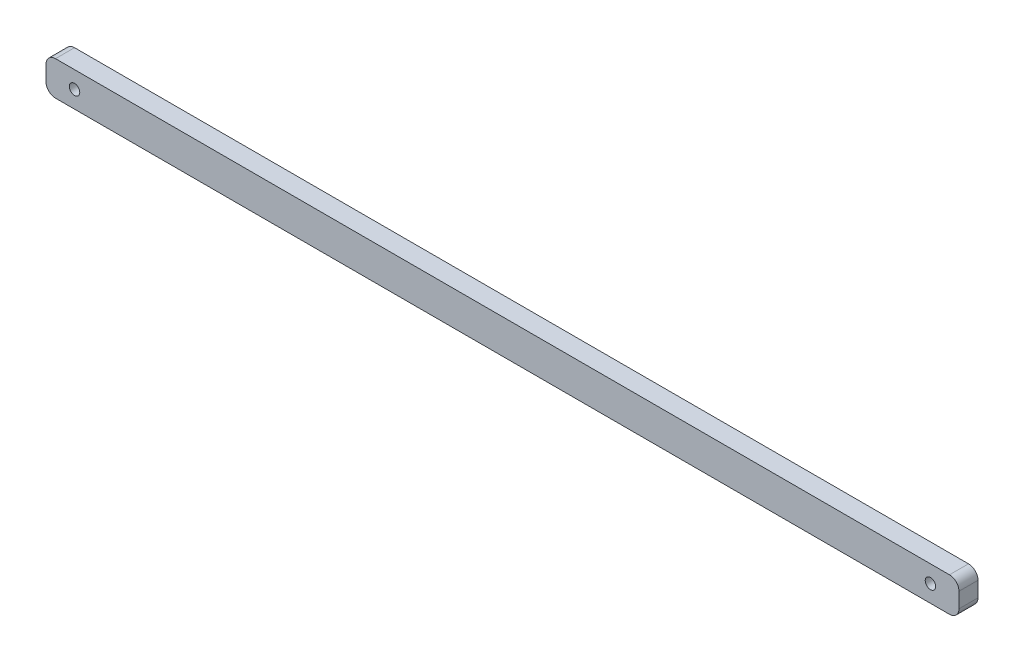
ISO-10303-21;
HEADER;
FILE_DESCRIPTION(('STEP AP214'),'2;1');
FILE_NAME('part.step','',(''),(''),'','','');
FILE_SCHEMA(('AUTOMOTIVE_DESIGN { 1 0 10303 214 1 1 1 1 }'));
ENDSEC;
DATA;
#1=APPLICATION_CONTEXT('core data for automotive mechanical design processes');
#2=APPLICATION_PROTOCOL_DEFINITION('international standard','automotive_design',2000,#1);
#3=PRODUCT_CONTEXT('',#1,'mechanical');
#4=PRODUCT('Part','Part','',(#3));
#5=PRODUCT_RELATED_PRODUCT_CATEGORY('part','',(#4));
#6=PRODUCT_DEFINITION_FORMATION('','',#4);
#7=PRODUCT_DEFINITION_CONTEXT('part definition',#1,'design');
#8=PRODUCT_DEFINITION('design','',#6,#7);
#9=PRODUCT_DEFINITION_SHAPE('','',#8);
#10=(LENGTH_UNIT() NAMED_UNIT(*) SI_UNIT(.MILLI.,.METRE.));
#11=(NAMED_UNIT(*) PLANE_ANGLE_UNIT() SI_UNIT($,.RADIAN.));
#12=(NAMED_UNIT(*) SI_UNIT($,.STERADIAN.) SOLID_ANGLE_UNIT());
#13=UNCERTAINTY_MEASURE_WITH_UNIT(LENGTH_MEASURE(1.E-05),#10,'distance_accuracy_value','');
#14=(GEOMETRIC_REPRESENTATION_CONTEXT(3) GLOBAL_UNCERTAINTY_ASSIGNED_CONTEXT((#13)) GLOBAL_UNIT_ASSIGNED_CONTEXT((#10,
#11,#12)) REPRESENTATION_CONTEXT('',''));
#15=CARTESIAN_POINT('',(0.,0.,0.));
#16=DIRECTION('',(0.,0.,1.));
#17=DIRECTION('',(1.,0.,0.));
#18=AXIS2_PLACEMENT_3D('',#15,#16,#17);
#19=CARTESIAN_POINT('',(0.,0.,10.));
#20=DIRECTION('',(0.,0.,1.));
#21=DIRECTION('',(1.,0.,0.));
#22=AXIS2_PLACEMENT_3D('',#19,#20,#21);
#23=PLANE('',#22);
#24=CARTESIAN_POINT('',(15.,-9.,10.));
#25=DIRECTION('',(0.,0.,1.));
#26=DIRECTION('',(1.,0.,0.));
#27=AXIS2_PLACEMENT_3D('',#24,#25,#26);
#28=CIRCLE('',#27,2.75);
#29=CARTESIAN_POINT('',(17.75,-9.,10.));
#30=VERTEX_POINT('',#29);
#31=EDGE_CURVE('E170',#30,#30,#28,.T.);
#32=ORIENTED_EDGE('',*,*,#31,.F.);
#33=EDGE_LOOP('',(#32));
#34=FACE_BOUND('',#33,.T.);
#35=DIRECTION('',(0.,1.,0.));
#36=VECTOR('',#35,1.);
#37=CARTESIAN_POINT('',(480.,0.,10.));
#38=LINE('',#37,#36);
#39=CARTESIAN_POINT('',(480.,-13.,10.));
#40=VERTEX_POINT('',#39);
#41=CARTESIAN_POINT('',(480.,-5.,10.));
#42=VERTEX_POINT('',#41);
#43=EDGE_CURVE('E174',#40,#42,#38,.T.);
#44=ORIENTED_EDGE('',*,*,#43,.T.);
#45=CARTESIAN_POINT('',(475.,-5.,10.));
#46=DIRECTION('',(0.,0.,1.));
#47=DIRECTION('',(1.,0.,0.));
#48=AXIS2_PLACEMENT_3D('',#45,#46,#47);
#49=CIRCLE('',#48,5.);
#50=CARTESIAN_POINT('',(475.,0.,10.));
#51=VERTEX_POINT('',#50);
#52=EDGE_CURVE('E151',#42,#51,#49,.T.);
#53=ORIENTED_EDGE('',*,*,#52,.T.);
#54=DIRECTION('',(-1.,0.,0.));
#55=VECTOR('',#54,1.);
#56=CARTESIAN_POINT('',(0.,0.,10.));
#57=LINE('',#56,#55);
#58=CARTESIAN_POINT('',(5.,0.,10.));
#59=VERTEX_POINT('',#58);
#60=EDGE_CURVE('E122',#51,#59,#57,.T.);
#61=ORIENTED_EDGE('',*,*,#60,.T.);
#62=CARTESIAN_POINT('',(5.,-5.,10.));
#63=DIRECTION('',(0.,0.,1.));
#64=DIRECTION('',(1.,0.,0.));
#65=AXIS2_PLACEMENT_3D('',#62,#63,#64);
#66=CIRCLE('',#65,5.);
#67=CARTESIAN_POINT('',(0.,-5.,10.));
#68=VERTEX_POINT('',#67);
#69=EDGE_CURVE('E147',#59,#68,#66,.T.);
#70=ORIENTED_EDGE('',*,*,#69,.T.);
#71=DIRECTION('',(0.,-1.,0.));
#72=VECTOR('',#71,1.);
#73=CARTESIAN_POINT('',(0.,0.,10.));
#74=LINE('',#73,#72);
#75=CARTESIAN_POINT('',(0.,-13.,10.));
#76=VERTEX_POINT('',#75);
#77=EDGE_CURVE('E130',#68,#76,#74,.T.);
#78=ORIENTED_EDGE('',*,*,#77,.T.);
#79=CARTESIAN_POINT('',(5.,-13.,10.));
#80=DIRECTION('',(0.,0.,1.));
#81=DIRECTION('',(1.,0.,0.));
#82=AXIS2_PLACEMENT_3D('',#79,#80,#81);
#83=CIRCLE('',#82,5.);
#84=CARTESIAN_POINT('',(5.,-18.,10.));
#85=VERTEX_POINT('',#84);
#86=EDGE_CURVE('E57',#76,#85,#83,.T.);
#87=ORIENTED_EDGE('',*,*,#86,.T.);
#88=DIRECTION('',(1.,0.,0.));
#89=VECTOR('',#88,1.);
#90=CARTESIAN_POINT('',(0.,-18.,10.));
#91=LINE('',#90,#89);
#92=CARTESIAN_POINT('',(475.,-18.,10.));
#93=VERTEX_POINT('',#92);
#94=EDGE_CURVE('E133',#85,#93,#91,.T.);
#95=ORIENTED_EDGE('',*,*,#94,.T.);
#96=CARTESIAN_POINT('',(475.,-13.,10.));
#97=DIRECTION('',(0.,0.,1.));
#98=DIRECTION('',(1.,0.,0.));
#99=AXIS2_PLACEMENT_3D('',#96,#97,#98);
#100=CIRCLE('',#99,5.);
#101=EDGE_CURVE('E149',#93,#40,#100,.T.);
#102=ORIENTED_EDGE('',*,*,#101,.T.);
#103=EDGE_LOOP('',(#44,#53,#61,#70,#78,#87,#95,#102));
#104=FACE_BOUND('',#103,.T.);
#105=CARTESIAN_POINT('',(465.,-9.,10.));
#106=DIRECTION('',(0.,0.,1.));
#107=DIRECTION('',(-1.,0.,0.));
#108=AXIS2_PLACEMENT_3D('',#105,#106,#107);
#109=CIRCLE('',#108,2.75000000000004);
#110=CARTESIAN_POINT('',(462.25,-9.,10.));
#111=VERTEX_POINT('',#110);
#112=EDGE_CURVE('E180',#111,#111,#109,.T.);
#113=ORIENTED_EDGE('',*,*,#112,.F.);
#114=EDGE_LOOP('',(#113));
#115=FACE_BOUND('',#114,.T.);
#116=ADVANCED_FACE('F35',(#34,#104,#115),#23,.T.);
#117=CARTESIAN_POINT('',(0.,0.,0.));
#118=DIRECTION('',(0.,0.,1.));
#119=DIRECTION('',(1.,0.,0.));
#120=AXIS2_PLACEMENT_3D('',#117,#118,#119);
#121=PLANE('',#120);
#122=DIRECTION('',(-1.,0.,0.));
#123=VECTOR('',#122,1.);
#124=CARTESIAN_POINT('',(0.,0.,0.));
#125=LINE('',#124,#123);
#126=CARTESIAN_POINT('',(475.,0.,0.));
#127=VERTEX_POINT('',#126);
#128=CARTESIAN_POINT('',(5.,0.,0.));
#129=VERTEX_POINT('',#128);
#130=EDGE_CURVE('E119',#127,#129,#125,.T.);
#131=ORIENTED_EDGE('',*,*,#130,.F.);
#132=CARTESIAN_POINT('',(475.,-5.,0.));
#133=DIRECTION('',(0.,0.,1.));
#134=DIRECTION('',(1.,0.,0.));
#135=AXIS2_PLACEMENT_3D('',#132,#133,#134);
#136=CIRCLE('',#135,5.);
#137=CARTESIAN_POINT('',(480.,-5.,0.));
#138=VERTEX_POINT('',#137);
#139=EDGE_CURVE('E102',#127,#138,#136,.F.);
#140=ORIENTED_EDGE('',*,*,#139,.T.);
#141=DIRECTION('',(0.,1.,0.));
#142=VECTOR('',#141,1.);
#143=CARTESIAN_POINT('',(480.,0.,0.));
#144=LINE('',#143,#142);
#145=CARTESIAN_POINT('',(480.,-13.,0.));
#146=VERTEX_POINT('',#145);
#147=EDGE_CURVE('E131',#146,#138,#144,.T.);
#148=ORIENTED_EDGE('',*,*,#147,.F.);
#149=CARTESIAN_POINT('',(475.,-13.,0.));
#150=DIRECTION('',(0.,0.,1.));
#151=DIRECTION('',(1.,0.,0.));
#152=AXIS2_PLACEMENT_3D('',#149,#150,#151);
#153=CIRCLE('',#152,5.);
#154=CARTESIAN_POINT('',(475.,-18.,0.));
#155=VERTEX_POINT('',#154);
#156=EDGE_CURVE('E113',#146,#155,#153,.F.);
#157=ORIENTED_EDGE('',*,*,#156,.T.);
#158=DIRECTION('',(1.,0.,0.));
#159=VECTOR('',#158,1.);
#160=CARTESIAN_POINT('',(0.,-18.,0.));
#161=LINE('',#160,#159);
#162=CARTESIAN_POINT('',(5.,-18.,0.));
#163=VERTEX_POINT('',#162);
#164=EDGE_CURVE('E135',#163,#155,#161,.T.);
#165=ORIENTED_EDGE('',*,*,#164,.F.);
#166=CARTESIAN_POINT('',(5.,-13.,0.));
#167=DIRECTION('',(0.,0.,1.));
#168=DIRECTION('',(1.,0.,0.));
#169=AXIS2_PLACEMENT_3D('',#166,#167,#168);
#170=CIRCLE('',#169,5.);
#171=CARTESIAN_POINT('',(0.,-13.,0.));
#172=VERTEX_POINT('',#171);
#173=EDGE_CURVE('E123',#163,#172,#170,.F.);
#174=ORIENTED_EDGE('',*,*,#173,.T.);
#175=DIRECTION('',(0.,-1.,0.));
#176=VECTOR('',#175,1.);
#177=CARTESIAN_POINT('',(0.,0.,0.));
#178=LINE('',#177,#176);
#179=CARTESIAN_POINT('',(0.,-5.,0.));
#180=VERTEX_POINT('',#179);
#181=EDGE_CURVE('E162',#180,#172,#178,.T.);
#182=ORIENTED_EDGE('',*,*,#181,.F.);
#183=CARTESIAN_POINT('',(5.,-5.,0.));
#184=DIRECTION('',(0.,0.,1.));
#185=DIRECTION('',(1.,0.,0.));
#186=AXIS2_PLACEMENT_3D('',#183,#184,#185);
#187=CIRCLE('',#186,5.);
#188=EDGE_CURVE('E129',#180,#129,#187,.F.);
#189=ORIENTED_EDGE('',*,*,#188,.T.);
#190=EDGE_LOOP('',(#131,#140,#148,#157,#165,#174,#182,#189));
#191=FACE_BOUND('',#190,.T.);
#192=CARTESIAN_POINT('',(15.,-9.,0.));
#193=DIRECTION('',(0.,0.,1.));
#194=DIRECTION('',(1.,0.,0.));
#195=AXIS2_PLACEMENT_3D('',#192,#193,#194);
#196=CIRCLE('',#195,2.75);
#197=CARTESIAN_POINT('',(17.75,-9.,0.));
#198=VERTEX_POINT('',#197);
#199=EDGE_CURVE('E177',#198,#198,#196,.T.);
#200=ORIENTED_EDGE('',*,*,#199,.T.);
#201=EDGE_LOOP('',(#200));
#202=FACE_BOUND('',#201,.T.);
#203=CARTESIAN_POINT('',(465.,-9.,0.));
#204=DIRECTION('',(0.,0.,1.));
#205=DIRECTION('',(-1.,0.,0.));
#206=AXIS2_PLACEMENT_3D('',#203,#204,#205);
#207=CIRCLE('',#206,2.75000000000004);
#208=CARTESIAN_POINT('',(462.25,-9.,0.));
#209=VERTEX_POINT('',#208);
#210=EDGE_CURVE('E183',#209,#209,#207,.T.);
#211=ORIENTED_EDGE('',*,*,#210,.T.);
#212=EDGE_LOOP('',(#211));
#213=FACE_BOUND('',#212,.T.);
#214=ADVANCED_FACE('F126',(#191,#202,#213),#121,.F.);
#215=CARTESIAN_POINT('',(0.,0.,10.));
#216=DIRECTION('',(1.,0.,0.));
#217=DIRECTION('',(0.,1.,0.));
#218=AXIS2_PLACEMENT_3D('',#215,#216,#217);
#219=PLANE('',#218);
#220=ORIENTED_EDGE('',*,*,#77,.F.);
#221=DIRECTION('',(0.,0.,-1.));
#222=VECTOR('',#221,1.);
#223=CARTESIAN_POINT('',(0.,-5.,10.));
#224=LINE('',#223,#222);
#225=EDGE_CURVE('E11',#68,#180,#224,.T.);
#226=ORIENTED_EDGE('',*,*,#225,.T.);
#227=ORIENTED_EDGE('',*,*,#181,.T.);
#228=DIRECTION('',(0.,0.,-1.));
#229=VECTOR('',#228,1.);
#230=CARTESIAN_POINT('',(0.,-13.,10.));
#231=LINE('',#230,#229);
#232=EDGE_CURVE('E43',#172,#76,#231,.F.);
#233=ORIENTED_EDGE('',*,*,#232,.T.);
#234=EDGE_LOOP('',(#220,#226,#227,#233));
#235=FACE_BOUND('',#234,.T.);
#236=ADVANCED_FACE('F160',(#235),#219,.F.);
#237=CARTESIAN_POINT('',(0.,-18.,10.));
#238=DIRECTION('',(0.,1.,0.));
#239=DIRECTION('',(0.,0.,1.));
#240=AXIS2_PLACEMENT_3D('',#237,#238,#239);
#241=PLANE('',#240);
#242=ORIENTED_EDGE('',*,*,#164,.T.);
#243=DIRECTION('',(0.,0.,-1.));
#244=VECTOR('',#243,1.);
#245=CARTESIAN_POINT('',(475.,-18.,10.));
#246=LINE('',#245,#244);
#247=EDGE_CURVE('E50',#155,#93,#246,.F.);
#248=ORIENTED_EDGE('',*,*,#247,.T.);
#249=ORIENTED_EDGE('',*,*,#94,.F.);
#250=DIRECTION('',(0.,0.,-1.));
#251=VECTOR('',#250,1.);
#252=CARTESIAN_POINT('',(5.,-18.,10.));
#253=LINE('',#252,#251);
#254=EDGE_CURVE('E153',#85,#163,#253,.T.);
#255=ORIENTED_EDGE('',*,*,#254,.T.);
#256=EDGE_LOOP('',(#242,#248,#249,#255));
#257=FACE_BOUND('',#256,.T.);
#258=ADVANCED_FACE('F169',(#257),#241,.F.);
#259=CARTESIAN_POINT('',(480.,0.,10.));
#260=DIRECTION('',(-1.,0.,0.));
#261=DIRECTION('',(0.,0.,1.));
#262=AXIS2_PLACEMENT_3D('',#259,#260,#261);
#263=PLANE('',#262);
#264=ORIENTED_EDGE('',*,*,#147,.T.);
#265=DIRECTION('',(0.,0.,-1.));
#266=VECTOR('',#265,1.);
#267=CARTESIAN_POINT('',(480.,-5.,10.));
#268=LINE('',#267,#266);
#269=EDGE_CURVE('E107',#138,#42,#268,.F.);
#270=ORIENTED_EDGE('',*,*,#269,.T.);
#271=ORIENTED_EDGE('',*,*,#43,.F.);
#272=DIRECTION('',(0.,0.,-1.));
#273=VECTOR('',#272,1.);
#274=CARTESIAN_POINT('',(480.,-13.,10.));
#275=LINE('',#274,#273);
#276=EDGE_CURVE('E112',#40,#146,#275,.T.);
#277=ORIENTED_EDGE('',*,*,#276,.T.);
#278=EDGE_LOOP('',(#264,#270,#271,#277));
#279=FACE_BOUND('',#278,.T.);
#280=ADVANCED_FACE('F205',(#279),#263,.F.);
#281=CARTESIAN_POINT('',(0.,0.,10.));
#282=DIRECTION('',(0.,-1.,0.));
#283=DIRECTION('',(0.,0.,-1.));
#284=AXIS2_PLACEMENT_3D('',#281,#282,#283);
#285=PLANE('',#284);
#286=ORIENTED_EDGE('',*,*,#60,.F.);
#287=DIRECTION('',(0.,0.,-1.));
#288=VECTOR('',#287,1.);
#289=CARTESIAN_POINT('',(475.,0.,10.));
#290=LINE('',#289,#288);
#291=EDGE_CURVE('E106',#51,#127,#290,.T.);
#292=ORIENTED_EDGE('',*,*,#291,.T.);
#293=ORIENTED_EDGE('',*,*,#130,.T.);
#294=DIRECTION('',(0.,0.,-1.));
#295=VECTOR('',#294,1.);
#296=CARTESIAN_POINT('',(5.,0.,10.));
#297=LINE('',#296,#295);
#298=EDGE_CURVE('E124',#129,#59,#297,.F.);
#299=ORIENTED_EDGE('',*,*,#298,.T.);
#300=EDGE_LOOP('',(#286,#292,#293,#299));
#301=FACE_BOUND('',#300,.T.);
#302=ADVANCED_FACE('F118',(#301),#285,.F.);
#303=CARTESIAN_POINT('',(15.,-9.,10.));
#304=DIRECTION('',(0.,0.,-1.));
#305=DIRECTION('',(-1.,0.,0.));
#306=AXIS2_PLACEMENT_3D('',#303,#304,#305);
#307=CYLINDRICAL_SURFACE('',#306,2.75);
#308=ORIENTED_EDGE('',*,*,#31,.T.);
#309=EDGE_LOOP('',(#308));
#310=FACE_BOUND('',#309,.T.);
#311=ORIENTED_EDGE('',*,*,#199,.F.);
#312=EDGE_LOOP('',(#311));
#313=FACE_BOUND('',#312,.T.);
#314=ADVANCED_FACE('F200',(#310,#313),#307,.F.);
#315=CARTESIAN_POINT('',(465.,-9.,10.));
#316=DIRECTION('',(0.,0.,-1.));
#317=DIRECTION('',(-1.,0.,0.));
#318=AXIS2_PLACEMENT_3D('',#315,#316,#317);
#319=CYLINDRICAL_SURFACE('',#318,2.75000000000004);
#320=ORIENTED_EDGE('',*,*,#112,.T.);
#321=EDGE_LOOP('',(#320));
#322=FACE_BOUND('',#321,.T.);
#323=ORIENTED_EDGE('',*,*,#210,.F.);
#324=EDGE_LOOP('',(#323));
#325=FACE_BOUND('',#324,.T.);
#326=ADVANCED_FACE('F189',(#322,#325),#319,.F.);
#327=CARTESIAN_POINT('',(475.,-5.,10.));
#328=DIRECTION('',(0.,0.,-1.));
#329=DIRECTION('',(-1.,0.,0.));
#330=AXIS2_PLACEMENT_3D('',#327,#328,#329);
#331=CYLINDRICAL_SURFACE('',#330,5.);
#332=ORIENTED_EDGE('',*,*,#52,.F.);
#333=ORIENTED_EDGE('',*,*,#269,.F.);
#334=ORIENTED_EDGE('',*,*,#139,.F.);
#335=ORIENTED_EDGE('',*,*,#291,.F.);
#336=EDGE_LOOP('',(#332,#333,#334,#335));
#337=FACE_BOUND('',#336,.T.);
#338=ADVANCED_FACE('F105',(#337),#331,.T.);
#339=CARTESIAN_POINT('',(475.,-13.,10.));
#340=DIRECTION('',(0.,0.,-1.));
#341=DIRECTION('',(-1.,0.,0.));
#342=AXIS2_PLACEMENT_3D('',#339,#340,#341);
#343=CYLINDRICAL_SURFACE('',#342,5.);
#344=ORIENTED_EDGE('',*,*,#101,.F.);
#345=ORIENTED_EDGE('',*,*,#247,.F.);
#346=ORIENTED_EDGE('',*,*,#156,.F.);
#347=ORIENTED_EDGE('',*,*,#276,.F.);
#348=EDGE_LOOP('',(#344,#345,#346,#347));
#349=FACE_BOUND('',#348,.T.);
#350=ADVANCED_FACE('F215',(#349),#343,.T.);
#351=CARTESIAN_POINT('',(5.,-5.,10.));
#352=DIRECTION('',(0.,0.,-1.));
#353=DIRECTION('',(-1.,0.,0.));
#354=AXIS2_PLACEMENT_3D('',#351,#352,#353);
#355=CYLINDRICAL_SURFACE('',#354,5.);
#356=ORIENTED_EDGE('',*,*,#69,.F.);
#357=ORIENTED_EDGE('',*,*,#298,.F.);
#358=ORIENTED_EDGE('',*,*,#188,.F.);
#359=ORIENTED_EDGE('',*,*,#225,.F.);
#360=EDGE_LOOP('',(#356,#357,#358,#359));
#361=FACE_BOUND('',#360,.T.);
#362=ADVANCED_FACE('F217',(#361),#355,.T.);
#363=CARTESIAN_POINT('',(5.,-13.,10.));
#364=DIRECTION('',(0.,0.,-1.));
#365=DIRECTION('',(-1.,0.,0.));
#366=AXIS2_PLACEMENT_3D('',#363,#364,#365);
#367=CYLINDRICAL_SURFACE('',#366,5.);
#368=ORIENTED_EDGE('',*,*,#86,.F.);
#369=ORIENTED_EDGE('',*,*,#232,.F.);
#370=ORIENTED_EDGE('',*,*,#173,.F.);
#371=ORIENTED_EDGE('',*,*,#254,.F.);
#372=EDGE_LOOP('',(#368,#369,#370,#371));
#373=FACE_BOUND('',#372,.T.);
#374=ADVANCED_FACE('F37',(#373),#367,.T.);
#375=CLOSED_SHELL('',(#116,#214,#236,#258,#280,#302,#314,#326,#338,#350,#362,#374));
#376=MANIFOLD_SOLID_BREP('B2',#375);
#377=ADVANCED_BREP_SHAPE_REPRESENTATION('',(#18,#376),#14);
#378=SHAPE_DEFINITION_REPRESENTATION(#9,#377);
ENDSEC;
END-ISO-10303-21;
